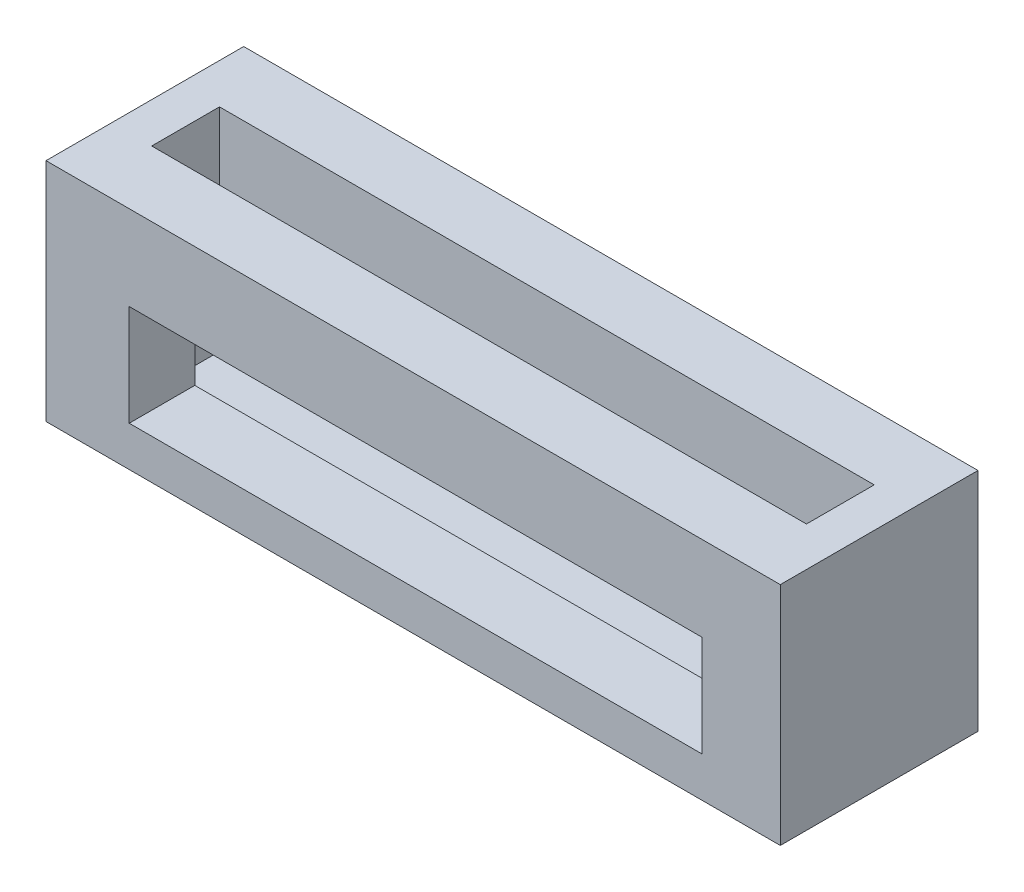
ISO-10303-21;
HEADER;
FILE_DESCRIPTION(('STEP AP214'),'2;1');
FILE_NAME('part.step','',(''),(''),'','','');
FILE_SCHEMA(('AUTOMOTIVE_DESIGN { 1 0 10303 214 1 1 1 1 }'));
ENDSEC;
DATA;
#1=APPLICATION_CONTEXT('core data for automotive mechanical design processes');
#2=APPLICATION_PROTOCOL_DEFINITION('international standard','automotive_design',2000,#1);
#3=PRODUCT_CONTEXT('',#1,'mechanical');
#4=PRODUCT('Part','Part','',(#3));
#5=PRODUCT_RELATED_PRODUCT_CATEGORY('part','',(#4));
#6=PRODUCT_DEFINITION_FORMATION('','',#4);
#7=PRODUCT_DEFINITION_CONTEXT('part definition',#1,'design');
#8=PRODUCT_DEFINITION('design','',#6,#7);
#9=PRODUCT_DEFINITION_SHAPE('','',#8);
#10=(LENGTH_UNIT() NAMED_UNIT(*) SI_UNIT(.MILLI.,.METRE.));
#11=(NAMED_UNIT(*) PLANE_ANGLE_UNIT() SI_UNIT($,.RADIAN.));
#12=(NAMED_UNIT(*) SI_UNIT($,.STERADIAN.) SOLID_ANGLE_UNIT());
#13=UNCERTAINTY_MEASURE_WITH_UNIT(LENGTH_MEASURE(1.E-05),#10,'distance_accuracy_value','');
#14=(GEOMETRIC_REPRESENTATION_CONTEXT(3) GLOBAL_UNCERTAINTY_ASSIGNED_CONTEXT((#13)) GLOBAL_UNIT_ASSIGNED_CONTEXT((#10,
#11,#12)) REPRESENTATION_CONTEXT('',''));
#15=CARTESIAN_POINT('',(0.,0.,0.));
#16=DIRECTION('',(0.,0.,1.));
#17=DIRECTION('',(1.,0.,0.));
#18=AXIS2_PLACEMENT_3D('',#15,#16,#17);
#19=CARTESIAN_POINT('',(29.4672378755424,14.211763667469,306.));
#20=DIRECTION('',(0.,1.,0.));
#21=DIRECTION('',(0.,0.,1.));
#22=AXIS2_PLACEMENT_3D('',#19,#20,#21);
#23=PLANE('',#22);
#24=DIRECTION('',(0.,0.,-1.));
#25=VECTOR('',#24,1.);
#26=CARTESIAN_POINT('',(232.194460671969,14.211763667469,306.));
#27=LINE('',#26,#25);
#28=CARTESIAN_POINT('',(232.194460671969,14.211763667469,70.0000000000001));
#29=VERTEX_POINT('',#28);
#30=CARTESIAN_POINT('',(232.194460671969,14.211763667469,46.7885908378431));
#31=VERTEX_POINT('',#30);
#32=EDGE_CURVE('E213',#29,#31,#27,.T.);
#33=ORIENTED_EDGE('',*,*,#32,.T.);
#34=DIRECTION('',(-1.,0.,0.));
#35=VECTOR('',#34,1.);
#36=CARTESIAN_POINT('',(29.4672378755424,14.211763667469,46.7885908378431));
#37=LINE('',#36,#35);
#38=CARTESIAN_POINT('',(29.4672378755424,14.211763667469,46.7885908378431));
#39=VERTEX_POINT('',#38);
#40=EDGE_CURVE('E189',#31,#39,#37,.T.);
#41=ORIENTED_EDGE('',*,*,#40,.T.);
#42=DIRECTION('',(0.,0.,-1.));
#43=VECTOR('',#42,1.);
#44=CARTESIAN_POINT('',(29.4672378755424,14.211763667469,306.));
#45=LINE('',#44,#43);
#46=CARTESIAN_POINT('',(29.4672378755424,14.211763667469,70.0000000000001));
#47=VERTEX_POINT('',#46);
#48=EDGE_CURVE('E201',#47,#39,#45,.T.);
#49=ORIENTED_EDGE('',*,*,#48,.F.);
#50=DIRECTION('',(1.,0.,0.));
#51=VECTOR('',#50,1.);
#52=CARTESIAN_POINT('',(0.,14.211763667469,70.));
#53=LINE('',#52,#51);
#54=EDGE_CURVE('E224',#47,#29,#53,.T.);
#55=ORIENTED_EDGE('',*,*,#54,.T.);
#56=EDGE_LOOP('',(#33,#41,#49,#55));
#57=FACE_BOUND('',#56,.T.);
#58=ADVANCED_FACE('F37',(#57),#23,.T.);
#59=CARTESIAN_POINT('',(232.194460671969,50.0000000000001,306.));
#60=DIRECTION('',(1.,0.,0.));
#61=DIRECTION('',(0.,0.,-1.));
#62=AXIS2_PLACEMENT_3D('',#59,#60,#61);
#63=PLANE('',#62);
#64=DIRECTION('',(0.,1.,0.));
#65=VECTOR('',#64,1.);
#66=CARTESIAN_POINT('',(232.194460671969,50.0000000000001,46.7885908378431));
#67=LINE('',#66,#65);
#68=CARTESIAN_POINT('',(232.194460671969,50.0000000000001,46.7885908378431));
#69=VERTEX_POINT('',#68);
#70=EDGE_CURVE('E187',#31,#69,#67,.T.);
#71=ORIENTED_EDGE('',*,*,#70,.F.);
#72=ORIENTED_EDGE('',*,*,#32,.F.);
#73=DIRECTION('',(0.,-1.,0.));
#74=VECTOR('',#73,1.);
#75=CARTESIAN_POINT('',(232.194460671969,80.,70.));
#76=LINE('',#75,#74);
#77=CARTESIAN_POINT('',(232.194460671969,50.0000000000001,70.0000000000001));
#78=VERTEX_POINT('',#77);
#79=EDGE_CURVE('E221',#78,#29,#76,.T.);
#80=ORIENTED_EDGE('',*,*,#79,.F.);
#81=DIRECTION('',(0.,0.,-1.));
#82=VECTOR('',#81,1.);
#83=CARTESIAN_POINT('',(232.194460671969,50.0000000000001,306.));
#84=LINE('',#83,#82);
#85=EDGE_CURVE('E209',#78,#69,#84,.T.);
#86=ORIENTED_EDGE('',*,*,#85,.T.);
#87=EDGE_LOOP('',(#71,#72,#80,#86));
#88=FACE_BOUND('',#87,.T.);
#89=ADVANCED_FACE('F284',(#88),#63,.F.);
#90=CARTESIAN_POINT('',(29.4672378755424,50.0000000000001,306.));
#91=DIRECTION('',(0.,1.,0.));
#92=DIRECTION('',(0.,0.,1.));
#93=AXIS2_PLACEMENT_3D('',#90,#91,#92);
#94=PLANE('',#93);
#95=DIRECTION('',(-1.,0.,0.));
#96=VECTOR('',#95,1.);
#97=CARTESIAN_POINT('',(29.4672378755424,50.0000000000001,46.7885908378431));
#98=LINE('',#97,#96);
#99=CARTESIAN_POINT('',(29.4672378755424,50.0000000000001,46.7885908378433));
#100=VERTEX_POINT('',#99);
#101=EDGE_CURVE('E60',#69,#100,#98,.T.);
#102=ORIENTED_EDGE('',*,*,#101,.F.);
#103=ORIENTED_EDGE('',*,*,#85,.F.);
#104=DIRECTION('',(1.,0.,0.));
#105=VECTOR('',#104,1.);
#106=CARTESIAN_POINT('',(0.,50.0000000000001,70.));
#107=LINE('',#106,#105);
#108=CARTESIAN_POINT('',(29.4672378755424,50.0000000000001,70.));
#109=VERTEX_POINT('',#108);
#110=EDGE_CURVE('E218',#109,#78,#107,.T.);
#111=ORIENTED_EDGE('',*,*,#110,.F.);
#112=DIRECTION('',(0.,0.,-1.));
#113=VECTOR('',#112,1.);
#114=CARTESIAN_POINT('',(29.4672378755424,50.0000000000001,306.));
#115=LINE('',#114,#113);
#116=EDGE_CURVE('E205',#109,#100,#115,.T.);
#117=ORIENTED_EDGE('',*,*,#116,.T.);
#118=EDGE_LOOP('',(#102,#103,#111,#117));
#119=FACE_BOUND('',#118,.T.);
#120=ADVANCED_FACE('F272',(#119),#94,.F.);
#121=CARTESIAN_POINT('',(29.4672378755424,50.0000000000001,306.));
#122=DIRECTION('',(1.,0.,0.));
#123=DIRECTION('',(0.,0.,-1.));
#124=AXIS2_PLACEMENT_3D('',#121,#122,#123);
#125=PLANE('',#124);
#126=ORIENTED_EDGE('',*,*,#48,.T.);
#127=DIRECTION('',(0.,1.,0.));
#128=VECTOR('',#127,1.);
#129=CARTESIAN_POINT('',(29.4672378755424,50.0000000000001,46.7885908378431));
#130=LINE('',#129,#128);
#131=EDGE_CURVE('E45',#39,#100,#130,.T.);
#132=ORIENTED_EDGE('',*,*,#131,.T.);
#133=ORIENTED_EDGE('',*,*,#116,.F.);
#134=DIRECTION('',(0.,-1.,0.));
#135=VECTOR('',#134,1.);
#136=CARTESIAN_POINT('',(29.4672378755424,80.,70.));
#137=LINE('',#136,#135);
#138=EDGE_CURVE('E216',#109,#47,#137,.T.);
#139=ORIENTED_EDGE('',*,*,#138,.T.);
#140=EDGE_LOOP('',(#126,#132,#133,#139));
#141=FACE_BOUND('',#140,.T.);
#142=ADVANCED_FACE('F268',(#141),#125,.T.);
#143=CARTESIAN_POINT('',(0.,80.,70.));
#144=DIRECTION('',(0.,0.,-1.));
#145=DIRECTION('',(-1.,0.,0.));
#146=AXIS2_PLACEMENT_3D('',#143,#144,#145);
#147=PLANE('',#146);
#148=DIRECTION('',(1.,0.,0.));
#149=VECTOR('',#148,1.);
#150=CARTESIAN_POINT('',(0.,0.,70.));
#151=LINE('',#150,#149);
#152=CARTESIAN_POINT('',(0.,0.,70.));
#153=VERTEX_POINT('',#152);
#154=CARTESIAN_POINT('',(260.,0.,70.));
#155=VERTEX_POINT('',#154);
#156=EDGE_CURVE('E240',#153,#155,#151,.T.);
#157=ORIENTED_EDGE('',*,*,#156,.T.);
#158=DIRECTION('',(0.,-1.,0.));
#159=VECTOR('',#158,1.);
#160=CARTESIAN_POINT('',(260.,80.,70.));
#161=LINE('',#160,#159);
#162=CARTESIAN_POINT('',(260.,80.,70.));
#163=VERTEX_POINT('',#162);
#164=EDGE_CURVE('E250',#163,#155,#161,.T.);
#165=ORIENTED_EDGE('',*,*,#164,.F.);
#166=DIRECTION('',(1.,0.,0.));
#167=VECTOR('',#166,1.);
#168=CARTESIAN_POINT('',(0.,80.,70.));
#169=LINE('',#168,#167);
#170=CARTESIAN_POINT('',(0.,80.,70.));
#171=VERTEX_POINT('',#170);
#172=EDGE_CURVE('E230',#171,#163,#169,.T.);
#173=ORIENTED_EDGE('',*,*,#172,.F.);
#174=DIRECTION('',(0.,-1.,0.));
#175=VECTOR('',#174,1.);
#176=CARTESIAN_POINT('',(0.,80.,70.));
#177=LINE('',#176,#175);
#178=EDGE_CURVE('E253',#171,#153,#177,.T.);
#179=ORIENTED_EDGE('',*,*,#178,.T.);
#180=EDGE_LOOP('',(#157,#165,#173,#179));
#181=FACE_BOUND('',#180,.T.);
#182=ORIENTED_EDGE('',*,*,#54,.F.);
#183=ORIENTED_EDGE('',*,*,#138,.F.);
#184=ORIENTED_EDGE('',*,*,#110,.T.);
#185=ORIENTED_EDGE('',*,*,#79,.T.);
#186=EDGE_LOOP('',(#182,#183,#184,#185));
#187=FACE_BOUND('',#186,.T.);
#188=ADVANCED_FACE('F277',(#181,#187),#147,.F.);
#189=CARTESIAN_POINT('',(0.,80.,0.));
#190=DIRECTION('',(0.,0.,1.));
#191=DIRECTION('',(1.,0.,0.));
#192=AXIS2_PLACEMENT_3D('',#189,#190,#191);
#193=PLANE('',#192);
#194=DIRECTION('',(-1.,0.,0.));
#195=VECTOR('',#194,1.);
#196=CARTESIAN_POINT('',(0.,0.,0.));
#197=LINE('',#196,#195);
#198=CARTESIAN_POINT('',(260.,0.,0.));
#199=VERTEX_POINT('',#198);
#200=CARTESIAN_POINT('',(0.,0.,0.));
#201=VERTEX_POINT('',#200);
#202=EDGE_CURVE('E231',#199,#201,#197,.T.);
#203=ORIENTED_EDGE('',*,*,#202,.T.);
#204=DIRECTION('',(0.,-1.,0.));
#205=VECTOR('',#204,1.);
#206=CARTESIAN_POINT('',(0.,80.,0.));
#207=LINE('',#206,#205);
#208=CARTESIAN_POINT('',(0.,80.,0.));
#209=VERTEX_POINT('',#208);
#210=EDGE_CURVE('E237',#209,#201,#207,.T.);
#211=ORIENTED_EDGE('',*,*,#210,.F.);
#212=DIRECTION('',(-1.,0.,0.));
#213=VECTOR('',#212,1.);
#214=CARTESIAN_POINT('',(0.,80.,0.));
#215=LINE('',#214,#213);
#216=CARTESIAN_POINT('',(260.,80.,0.));
#217=VERTEX_POINT('',#216);
#218=EDGE_CURVE('E235',#217,#209,#215,.T.);
#219=ORIENTED_EDGE('',*,*,#218,.F.);
#220=DIRECTION('',(0.,-1.,0.));
#221=VECTOR('',#220,1.);
#222=CARTESIAN_POINT('',(260.,80.,0.));
#223=LINE('',#222,#221);
#224=EDGE_CURVE('E247',#217,#199,#223,.T.);
#225=ORIENTED_EDGE('',*,*,#224,.T.);
#226=EDGE_LOOP('',(#203,#211,#219,#225));
#227=FACE_BOUND('',#226,.T.);
#228=DIRECTION('',(-1.,0.,0.));
#229=VECTOR('',#228,1.);
#230=CARTESIAN_POINT('',(0.,14.211763667469,0.));
#231=LINE('',#230,#229);
#232=CARTESIAN_POINT('',(232.194460671969,14.211763667469,1.11022302462516E-13));
#233=VERTEX_POINT('',#232);
#234=CARTESIAN_POINT('',(29.4672378755424,14.211763667469,0.));
#235=VERTEX_POINT('',#234);
#236=EDGE_CURVE('E265',#233,#235,#231,.T.);
#237=ORIENTED_EDGE('',*,*,#236,.F.);
#238=DIRECTION('',(0.,1.,0.));
#239=VECTOR('',#238,1.);
#240=CARTESIAN_POINT('',(232.194460671969,80.,0.));
#241=LINE('',#240,#239);
#242=CARTESIAN_POINT('',(232.194460671969,50.0000000000001,1.11022302462516E-13));
#243=VERTEX_POINT('',#242);
#244=EDGE_CURVE('E262',#233,#243,#241,.T.);
#245=ORIENTED_EDGE('',*,*,#244,.T.);
#246=DIRECTION('',(-1.,0.,0.));
#247=VECTOR('',#246,1.);
#248=CARTESIAN_POINT('',(0.,50.0000000000001,0.));
#249=LINE('',#248,#247);
#250=CARTESIAN_POINT('',(29.4672378755424,50.0000000000001,1.11022302462516E-13));
#251=VERTEX_POINT('',#250);
#252=EDGE_CURVE('E259',#243,#251,#249,.T.);
#253=ORIENTED_EDGE('',*,*,#252,.T.);
#254=DIRECTION('',(0.,1.,0.));
#255=VECTOR('',#254,1.);
#256=CARTESIAN_POINT('',(29.4672378755424,80.,0.));
#257=LINE('',#256,#255);
#258=EDGE_CURVE('E256',#235,#251,#257,.T.);
#259=ORIENTED_EDGE('',*,*,#258,.F.);
#260=EDGE_LOOP('',(#237,#245,#253,#259));
#261=FACE_BOUND('',#260,.T.);
#262=ADVANCED_FACE('F319',(#227,#261),#193,.F.);
#263=CARTESIAN_POINT('',(0.,80.,0.));
#264=DIRECTION('',(1.,0.,0.));
#265=DIRECTION('',(0.,0.,-1.));
#266=AXIS2_PLACEMENT_3D('',#263,#264,#265);
#267=PLANE('',#266);
#268=DIRECTION('',(0.,0.,1.));
#269=VECTOR('',#268,1.);
#270=CARTESIAN_POINT('',(0.,0.,0.));
#271=LINE('',#270,#269);
#272=EDGE_CURVE('E226',#201,#153,#271,.T.);
#273=ORIENTED_EDGE('',*,*,#272,.T.);
#274=ORIENTED_EDGE('',*,*,#178,.F.);
#275=DIRECTION('',(0.,0.,1.));
#276=VECTOR('',#275,1.);
#277=CARTESIAN_POINT('',(0.,80.,0.));
#278=LINE('',#277,#276);
#279=EDGE_CURVE('E227',#209,#171,#278,.T.);
#280=ORIENTED_EDGE('',*,*,#279,.F.);
#281=ORIENTED_EDGE('',*,*,#210,.T.);
#282=EDGE_LOOP('',(#273,#274,#280,#281));
#283=FACE_BOUND('',#282,.T.);
#284=ADVANCED_FACE('F39',(#283),#267,.F.);
#285=CARTESIAN_POINT('',(260.,80.,0.));
#286=DIRECTION('',(-1.,0.,0.));
#287=DIRECTION('',(0.,0.,1.));
#288=AXIS2_PLACEMENT_3D('',#285,#286,#287);
#289=PLANE('',#288);
#290=DIRECTION('',(0.,0.,-1.));
#291=VECTOR('',#290,1.);
#292=CARTESIAN_POINT('',(260.,0.,0.));
#293=LINE('',#292,#291);
#294=EDGE_CURVE('E242',#155,#199,#293,.T.);
#295=ORIENTED_EDGE('',*,*,#294,.T.);
#296=ORIENTED_EDGE('',*,*,#224,.F.);
#297=DIRECTION('',(0.,0.,-1.));
#298=VECTOR('',#297,1.);
#299=CARTESIAN_POINT('',(260.,80.,0.));
#300=LINE('',#299,#298);
#301=EDGE_CURVE('E233',#163,#217,#300,.T.);
#302=ORIENTED_EDGE('',*,*,#301,.F.);
#303=ORIENTED_EDGE('',*,*,#164,.T.);
#304=EDGE_LOOP('',(#295,#296,#302,#303));
#305=FACE_BOUND('',#304,.T.);
#306=ADVANCED_FACE('F327',(#305),#289,.F.);
#307=CARTESIAN_POINT('',(0.,80.,0.));
#308=DIRECTION('',(0.,1.,0.));
#309=DIRECTION('',(0.,0.,1.));
#310=AXIS2_PLACEMENT_3D('',#307,#308,#309);
#311=PLANE('',#310);
#312=DIRECTION('',(-1.,0.,0.));
#313=VECTOR('',#312,1.);
#314=CARTESIAN_POINT('',(0.,80.,22.7885908378432));
#315=LINE('',#314,#313);
#316=CARTESIAN_POINT('',(246.04635114584,80.,22.7885908378431));
#317=VERTEX_POINT('',#316);
#318=CARTESIAN_POINT('',(14.2190694447264,80.,22.7885908378432));
#319=VERTEX_POINT('',#318);
#320=EDGE_CURVE('E52',#317,#319,#315,.T.);
#321=ORIENTED_EDGE('',*,*,#320,.F.);
#322=DIRECTION('',(0.,0.,1.));
#323=VECTOR('',#322,1.);
#324=CARTESIAN_POINT('',(246.04635114584,80.,0.));
#325=LINE('',#324,#323);
#326=CARTESIAN_POINT('',(246.04635114584,80.,46.7885908378431));
#327=VERTEX_POINT('',#326);
#328=EDGE_CURVE('E168',#317,#327,#325,.T.);
#329=ORIENTED_EDGE('',*,*,#328,.T.);
#330=DIRECTION('',(-1.,0.,0.));
#331=VECTOR('',#330,1.);
#332=CARTESIAN_POINT('',(0.,80.,46.7885908378432));
#333=LINE('',#332,#331);
#334=CARTESIAN_POINT('',(14.2190694447264,80.,46.7885908378432));
#335=VERTEX_POINT('',#334);
#336=EDGE_CURVE('E171',#327,#335,#333,.T.);
#337=ORIENTED_EDGE('',*,*,#336,.T.);
#338=DIRECTION('',(0.,0.,1.));
#339=VECTOR('',#338,1.);
#340=CARTESIAN_POINT('',(14.2190694447264,80.,0.));
#341=LINE('',#340,#339);
#342=EDGE_CURVE('E177',#319,#335,#341,.T.);
#343=ORIENTED_EDGE('',*,*,#342,.F.);
#344=EDGE_LOOP('',(#321,#329,#337,#343));
#345=FACE_BOUND('',#344,.T.);
#346=ORIENTED_EDGE('',*,*,#279,.T.);
#347=ORIENTED_EDGE('',*,*,#172,.T.);
#348=ORIENTED_EDGE('',*,*,#301,.T.);
#349=ORIENTED_EDGE('',*,*,#218,.T.);
#350=EDGE_LOOP('',(#346,#347,#348,#349));
#351=FACE_BOUND('',#350,.T.);
#352=ADVANCED_FACE('F334',(#345,#351),#311,.T.);
#353=CARTESIAN_POINT('',(0.,0.,0.));
#354=DIRECTION('',(0.,1.,0.));
#355=DIRECTION('',(0.,0.,1.));
#356=AXIS2_PLACEMENT_3D('',#353,#354,#355);
#357=PLANE('',#356);
#358=ORIENTED_EDGE('',*,*,#272,.F.);
#359=ORIENTED_EDGE('',*,*,#202,.F.);
#360=ORIENTED_EDGE('',*,*,#294,.F.);
#361=ORIENTED_EDGE('',*,*,#156,.F.);
#362=EDGE_LOOP('',(#358,#359,#360,#361));
#363=FACE_BOUND('',#362,.T.);
#364=ADVANCED_FACE('F304',(#363),#357,.F.);
#365=DIRECTION('',(-1.,0.,0.));
#366=VECTOR('',#365,1.);
#367=CARTESIAN_POINT('',(29.4672378755424,14.211763667469,22.7885908378432));
#368=LINE('',#367,#366);
#369=CARTESIAN_POINT('',(232.194460671969,14.211763667469,22.7885908378431));
#370=VERTEX_POINT('',#369);
#371=CARTESIAN_POINT('',(29.4672378755424,14.211763667469,22.7885908378433));
#372=VERTEX_POINT('',#371);
#373=EDGE_CURVE('E198',#370,#372,#368,.T.);
#374=ORIENTED_EDGE('',*,*,#373,.F.);
#375=EDGE_CURVE('E212',#370,#233,#27,.T.);
#376=ORIENTED_EDGE('',*,*,#375,.T.);
#377=ORIENTED_EDGE('',*,*,#236,.T.);
#378=EDGE_CURVE('E200',#372,#235,#45,.T.);
#379=ORIENTED_EDGE('',*,*,#378,.F.);
#380=EDGE_LOOP('',(#374,#376,#377,#379));
#381=FACE_BOUND('',#380,.T.);
#382=ADVANCED_FACE('F295',(#381),#23,.T.);
#383=ORIENTED_EDGE('',*,*,#375,.F.);
#384=DIRECTION('',(0.,1.,0.));
#385=VECTOR('',#384,1.);
#386=CARTESIAN_POINT('',(232.194460671969,50.0000000000001,22.7885908378431));
#387=LINE('',#386,#385);
#388=CARTESIAN_POINT('',(232.194460671969,50.0000000000001,22.7885908378432));
#389=VERTEX_POINT('',#388);
#390=EDGE_CURVE('E195',#370,#389,#387,.T.);
#391=ORIENTED_EDGE('',*,*,#390,.T.);
#392=EDGE_CURVE('E208',#389,#243,#84,.T.);
#393=ORIENTED_EDGE('',*,*,#392,.T.);
#394=ORIENTED_EDGE('',*,*,#244,.F.);
#395=EDGE_LOOP('',(#383,#391,#393,#394));
#396=FACE_BOUND('',#395,.T.);
#397=ADVANCED_FACE('F287',(#396),#63,.F.);
#398=ORIENTED_EDGE('',*,*,#392,.F.);
#399=DIRECTION('',(-1.,0.,0.));
#400=VECTOR('',#399,1.);
#401=CARTESIAN_POINT('',(29.4672378755424,50.0000000000001,22.7885908378432));
#402=LINE('',#401,#400);
#403=CARTESIAN_POINT('',(29.4672378755424,50.0000000000001,22.7885908378432));
#404=VERTEX_POINT('',#403);
#405=EDGE_CURVE('E192',#389,#404,#402,.T.);
#406=ORIENTED_EDGE('',*,*,#405,.T.);
#407=EDGE_CURVE('E204',#404,#251,#115,.T.);
#408=ORIENTED_EDGE('',*,*,#407,.T.);
#409=ORIENTED_EDGE('',*,*,#252,.F.);
#410=EDGE_LOOP('',(#398,#406,#408,#409));
#411=FACE_BOUND('',#410,.T.);
#412=ADVANCED_FACE('F293',(#411),#94,.F.);
#413=DIRECTION('',(0.,1.,0.));
#414=VECTOR('',#413,1.);
#415=CARTESIAN_POINT('',(29.4672378755424,50.0000000000001,22.7885908378432));
#416=LINE('',#415,#414);
#417=EDGE_CURVE('E11',#372,#404,#416,.T.);
#418=ORIENTED_EDGE('',*,*,#417,.F.);
#419=ORIENTED_EDGE('',*,*,#378,.T.);
#420=ORIENTED_EDGE('',*,*,#258,.T.);
#421=ORIENTED_EDGE('',*,*,#407,.F.);
#422=EDGE_LOOP('',(#418,#419,#420,#421));
#423=FACE_BOUND('',#422,.T.);
#424=ADVANCED_FACE('F302',(#423),#125,.T.);
#425=CARTESIAN_POINT('',(0.,5.,22.7885908378432));
#426=DIRECTION('',(0.,0.,-1.));
#427=DIRECTION('',(-1.,0.,0.));
#428=AXIS2_PLACEMENT_3D('',#425,#426,#427);
#429=PLANE('',#428);
#430=ORIENTED_EDGE('',*,*,#373,.T.);
#431=ORIENTED_EDGE('',*,*,#417,.T.);
#432=ORIENTED_EDGE('',*,*,#405,.F.);
#433=ORIENTED_EDGE('',*,*,#390,.F.);
#434=EDGE_LOOP('',(#430,#431,#432,#433));
#435=FACE_BOUND('',#434,.T.);
#436=ORIENTED_EDGE('',*,*,#320,.T.);
#437=DIRECTION('',(0.,1.,0.));
#438=VECTOR('',#437,1.);
#439=CARTESIAN_POINT('',(14.2190694447264,5.,22.7885908378432));
#440=LINE('',#439,#438);
#441=CARTESIAN_POINT('',(14.2190694447264,5.,22.7885908378432));
#442=VERTEX_POINT('',#441);
#443=EDGE_CURVE('E147',#442,#319,#440,.T.);
#444=ORIENTED_EDGE('',*,*,#443,.F.);
#445=DIRECTION('',(-1.,0.,0.));
#446=VECTOR('',#445,1.);
#447=CARTESIAN_POINT('',(0.,5.,22.7885908378432));
#448=LINE('',#447,#446);
#449=CARTESIAN_POINT('',(246.04635114584,5.,22.7885908378431));
#450=VERTEX_POINT('',#449);
#451=EDGE_CURVE('E151',#450,#442,#448,.T.);
#452=ORIENTED_EDGE('',*,*,#451,.F.);
#453=DIRECTION('',(0.,1.,0.));
#454=VECTOR('',#453,1.);
#455=CARTESIAN_POINT('',(246.04635114584,5.,22.7885908378431));
#456=LINE('',#455,#454);
#457=EDGE_CURVE('E181',#450,#317,#456,.T.);
#458=ORIENTED_EDGE('',*,*,#457,.T.);
#459=EDGE_LOOP('',(#436,#444,#452,#458));
#460=FACE_BOUND('',#459,.T.);
#461=ADVANCED_FACE('F149',(#435,#460),#429,.F.);
#462=CARTESIAN_POINT('',(246.04635114584,5.,0.));
#463=DIRECTION('',(-1.,0.,0.));
#464=DIRECTION('',(0.,0.,1.));
#465=AXIS2_PLACEMENT_3D('',#462,#463,#464);
#466=PLANE('',#465);
#467=ORIENTED_EDGE('',*,*,#328,.F.);
#468=ORIENTED_EDGE('',*,*,#457,.F.);
#469=DIRECTION('',(0.,0.,1.));
#470=VECTOR('',#469,1.);
#471=CARTESIAN_POINT('',(246.04635114584,5.,0.));
#472=LINE('',#471,#470);
#473=CARTESIAN_POINT('',(246.04635114584,5.,46.7885908378431));
#474=VERTEX_POINT('',#473);
#475=EDGE_CURVE('E156',#450,#474,#472,.T.);
#476=ORIENTED_EDGE('',*,*,#475,.T.);
#477=DIRECTION('',(0.,1.,0.));
#478=VECTOR('',#477,1.);
#479=CARTESIAN_POINT('',(246.04635114584,5.,46.7885908378431));
#480=LINE('',#479,#478);
#481=EDGE_CURVE('E183',#474,#327,#480,.T.);
#482=ORIENTED_EDGE('',*,*,#481,.T.);
#483=EDGE_LOOP('',(#467,#468,#476,#482));
#484=FACE_BOUND('',#483,.T.);
#485=ADVANCED_FACE('F398',(#484),#466,.T.);
#486=CARTESIAN_POINT('',(0.,5.,46.7885908378432));
#487=DIRECTION('',(0.,0.,-1.));
#488=DIRECTION('',(-1.,0.,0.));
#489=AXIS2_PLACEMENT_3D('',#486,#487,#488);
#490=PLANE('',#489);
#491=ORIENTED_EDGE('',*,*,#70,.T.);
#492=ORIENTED_EDGE('',*,*,#101,.T.);
#493=ORIENTED_EDGE('',*,*,#131,.F.);
#494=ORIENTED_EDGE('',*,*,#40,.F.);
#495=EDGE_LOOP('',(#491,#492,#493,#494));
#496=FACE_BOUND('',#495,.T.);
#497=ORIENTED_EDGE('',*,*,#336,.F.);
#498=ORIENTED_EDGE('',*,*,#481,.F.);
#499=DIRECTION('',(-1.,0.,0.));
#500=VECTOR('',#499,1.);
#501=CARTESIAN_POINT('',(0.,5.,46.7885908378432));
#502=LINE('',#501,#500);
#503=CARTESIAN_POINT('',(14.2190694447264,5.,46.7885908378432));
#504=VERTEX_POINT('',#503);
#505=EDGE_CURVE('E164',#474,#504,#502,.T.);
#506=ORIENTED_EDGE('',*,*,#505,.T.);
#507=DIRECTION('',(0.,1.,0.));
#508=VECTOR('',#507,1.);
#509=CARTESIAN_POINT('',(14.2190694447264,5.,46.7885908378432));
#510=LINE('',#509,#508);
#511=EDGE_CURVE('E155',#504,#335,#510,.T.);
#512=ORIENTED_EDGE('',*,*,#511,.T.);
#513=EDGE_LOOP('',(#497,#498,#506,#512));
#514=FACE_BOUND('',#513,.T.);
#515=ADVANCED_FACE('F281',(#496,#514),#490,.T.);
#516=CARTESIAN_POINT('',(14.2190694447264,5.,0.));
#517=DIRECTION('',(-1.,0.,0.));
#518=DIRECTION('',(0.,0.,1.));
#519=AXIS2_PLACEMENT_3D('',#516,#517,#518);
#520=PLANE('',#519);
#521=ORIENTED_EDGE('',*,*,#342,.T.);
#522=ORIENTED_EDGE('',*,*,#511,.F.);
#523=DIRECTION('',(0.,0.,1.));
#524=VECTOR('',#523,1.);
#525=CARTESIAN_POINT('',(14.2190694447264,5.,0.));
#526=LINE('',#525,#524);
#527=EDGE_CURVE('E160',#442,#504,#526,.T.);
#528=ORIENTED_EDGE('',*,*,#527,.F.);
#529=ORIENTED_EDGE('',*,*,#443,.T.);
#530=EDGE_LOOP('',(#521,#522,#528,#529));
#531=FACE_BOUND('',#530,.T.);
#532=ADVANCED_FACE('F161',(#531),#520,.F.);
#533=CARTESIAN_POINT('',(0.,5.,0.));
#534=DIRECTION('',(0.,1.,0.));
#535=DIRECTION('',(0.,0.,1.));
#536=AXIS2_PLACEMENT_3D('',#533,#534,#535);
#537=PLANE('',#536);
#538=ORIENTED_EDGE('',*,*,#451,.T.);
#539=ORIENTED_EDGE('',*,*,#527,.T.);
#540=ORIENTED_EDGE('',*,*,#505,.F.);
#541=ORIENTED_EDGE('',*,*,#475,.F.);
#542=EDGE_LOOP('',(#538,#539,#540,#541));
#543=FACE_BOUND('',#542,.T.);
#544=ADVANCED_FACE('F167',(#543),#537,.T.);
#545=CLOSED_SHELL('',(#58,#89,#120,#142,#188,#262,#284,#306,#352,#364,#382,#397,#412,#424,#461,
#485,#515,#532,#544));
#546=MANIFOLD_SOLID_BREP('B2',#545);
#547=ADVANCED_BREP_SHAPE_REPRESENTATION('',(#18,#546),#14);
#548=SHAPE_DEFINITION_REPRESENTATION(#9,#547);
ENDSEC;
END-ISO-10303-21;
